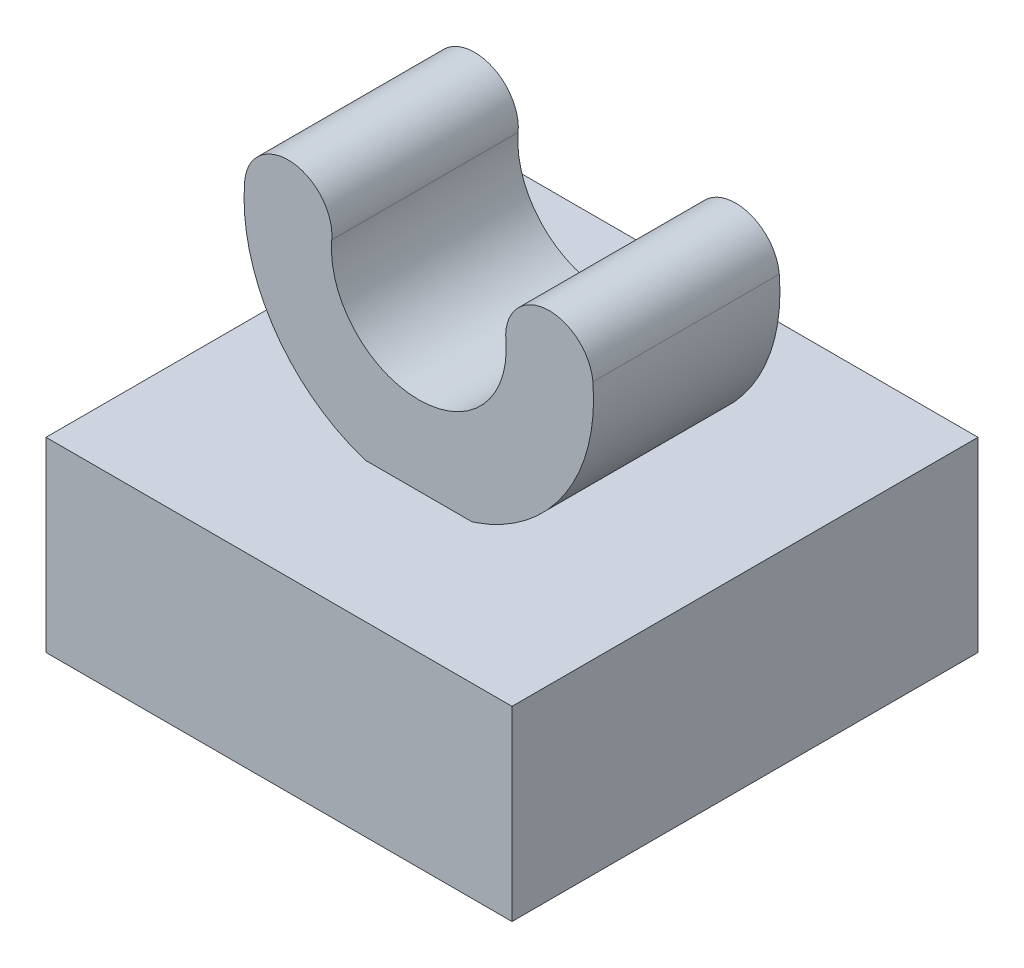
ISO-10303-21;
HEADER;
FILE_DESCRIPTION(('STEP AP214'),'2;1');
FILE_NAME('part.step','',(''),(''),'','','');
FILE_SCHEMA(('AUTOMOTIVE_DESIGN { 1 0 10303 214 1 1 1 1 }'));
ENDSEC;
DATA;
#1=APPLICATION_CONTEXT('core data for automotive mechanical design processes');
#2=APPLICATION_PROTOCOL_DEFINITION('international standard','automotive_design',2000,#1);
#3=PRODUCT_CONTEXT('',#1,'mechanical');
#4=PRODUCT('Part','Part','',(#3));
#5=PRODUCT_RELATED_PRODUCT_CATEGORY('part','',(#4));
#6=PRODUCT_DEFINITION_FORMATION('','',#4);
#7=PRODUCT_DEFINITION_CONTEXT('part definition',#1,'design');
#8=PRODUCT_DEFINITION('design','',#6,#7);
#9=PRODUCT_DEFINITION_SHAPE('','',#8);
#10=(LENGTH_UNIT() NAMED_UNIT(*) SI_UNIT(.MILLI.,.METRE.));
#11=(NAMED_UNIT(*) PLANE_ANGLE_UNIT() SI_UNIT($,.RADIAN.));
#12=(NAMED_UNIT(*) SI_UNIT($,.STERADIAN.) SOLID_ANGLE_UNIT());
#13=UNCERTAINTY_MEASURE_WITH_UNIT(LENGTH_MEASURE(1.E-05),#10,'distance_accuracy_value','');
#14=(GEOMETRIC_REPRESENTATION_CONTEXT(3) GLOBAL_UNCERTAINTY_ASSIGNED_CONTEXT((#13)) GLOBAL_UNIT_ASSIGNED_CONTEXT((#10,
#11,#12)) REPRESENTATION_CONTEXT('',''));
#15=CARTESIAN_POINT('',(0.,0.,0.));
#16=DIRECTION('',(0.,0.,1.));
#17=DIRECTION('',(1.,0.,0.));
#18=AXIS2_PLACEMENT_3D('',#15,#16,#17);
#19=CARTESIAN_POINT('',(-4.,-6.05675355524895,-2.4));
#20=DIRECTION('',(-1.,0.,0.));
#21=DIRECTION('',(0.,0.,1.));
#22=AXIS2_PLACEMENT_3D('',#19,#20,#21);
#23=PLANE('',#22);
#24=DIRECTION('',(0.,-1.,0.));
#25=VECTOR('',#24,1.);
#26=CARTESIAN_POINT('',(-4.,-6.05675355524895,5.6));
#27=LINE('',#26,#25);
#28=CARTESIAN_POINT('',(-4.,-2.85675355524895,5.6));
#29=VERTEX_POINT('',#28);
#30=CARTESIAN_POINT('',(-4.,-6.05675355524895,5.6));
#31=VERTEX_POINT('',#30);
#32=EDGE_CURVE('E170',#29,#31,#27,.T.);
#33=ORIENTED_EDGE('',*,*,#32,.F.);
#34=DIRECTION('',(0.,0.,1.));
#35=VECTOR('',#34,1.);
#36=CARTESIAN_POINT('',(-4.,-2.85675355524895,-2.4));
#37=LINE('',#36,#35);
#38=CARTESIAN_POINT('',(-4.,-2.85675355524895,-2.4));
#39=VERTEX_POINT('',#38);
#40=EDGE_CURVE('E12',#39,#29,#37,.T.);
#41=ORIENTED_EDGE('',*,*,#40,.F.);
#42=DIRECTION('',(0.,-1.,0.));
#43=VECTOR('',#42,1.);
#44=CARTESIAN_POINT('',(-4.,-6.05675355524895,-2.4));
#45=LINE('',#44,#43);
#46=CARTESIAN_POINT('',(-4.,-6.05675355524895,-2.4));
#47=VERTEX_POINT('',#46);
#48=EDGE_CURVE('E176',#39,#47,#45,.T.);
#49=ORIENTED_EDGE('',*,*,#48,.T.);
#50=DIRECTION('',(0.,0.,1.));
#51=VECTOR('',#50,1.);
#52=CARTESIAN_POINT('',(-4.,-6.05675355524895,-2.4));
#53=LINE('',#52,#51);
#54=EDGE_CURVE('E55',#47,#31,#53,.T.);
#55=ORIENTED_EDGE('',*,*,#54,.T.);
#56=EDGE_LOOP('',(#33,#41,#49,#55));
#57=FACE_BOUND('',#56,.T.);
#58=ADVANCED_FACE('F52',(#57),#23,.T.);
#59=CARTESIAN_POINT('',(-4.,-2.85675355524895,-2.4));
#60=DIRECTION('',(0.,1.,0.));
#61=DIRECTION('',(-1.,0.,0.));
#62=AXIS2_PLACEMENT_3D('',#59,#60,#61);
#63=PLANE('',#62);
#64=DIRECTION('',(-1.,0.,0.));
#65=VECTOR('',#64,1.);
#66=CARTESIAN_POINT('',(-4.,-2.85675355524895,5.6));
#67=LINE('',#66,#65);
#68=CARTESIAN_POINT('',(4.,-2.85675355524895,5.6));
#69=VERTEX_POINT('',#68);
#70=EDGE_CURVE('E180',#69,#29,#67,.T.);
#71=ORIENTED_EDGE('',*,*,#70,.F.);
#72=DIRECTION('',(0.,0.,1.));
#73=VECTOR('',#72,1.);
#74=CARTESIAN_POINT('',(4.,-2.85675355524895,-2.4));
#75=LINE('',#74,#73);
#76=CARTESIAN_POINT('',(4.,-2.85675355524895,-2.4));
#77=VERTEX_POINT('',#76);
#78=EDGE_CURVE('E61',#77,#69,#75,.T.);
#79=ORIENTED_EDGE('',*,*,#78,.F.);
#80=DIRECTION('',(-1.,0.,0.));
#81=VECTOR('',#80,1.);
#82=CARTESIAN_POINT('',(-4.,-2.85675355524895,-2.4));
#83=LINE('',#82,#81);
#84=EDGE_CURVE('E187',#77,#39,#83,.T.);
#85=ORIENTED_EDGE('',*,*,#84,.T.);
#86=ORIENTED_EDGE('',*,*,#40,.T.);
#87=EDGE_LOOP('',(#71,#79,#85,#86));
#88=FACE_BOUND('',#87,.T.);
#89=ADVANCED_FACE('F212',(#88),#63,.T.);
#90=CARTESIAN_POINT('',(4.,-6.05675355524895,-2.4));
#91=DIRECTION('',(1.,0.,0.));
#92=DIRECTION('',(0.,1.,0.));
#93=AXIS2_PLACEMENT_3D('',#90,#91,#92);
#94=PLANE('',#93);
#95=DIRECTION('',(0.,1.,0.));
#96=VECTOR('',#95,1.);
#97=CARTESIAN_POINT('',(4.,-6.05675355524895,5.6));
#98=LINE('',#97,#96);
#99=CARTESIAN_POINT('',(4.,-6.05675355524895,5.6));
#100=VERTEX_POINT('',#99);
#101=EDGE_CURVE('E197',#100,#69,#98,.T.);
#102=ORIENTED_EDGE('',*,*,#101,.F.);
#103=DIRECTION('',(0.,0.,1.));
#104=VECTOR('',#103,1.);
#105=CARTESIAN_POINT('',(4.,-6.05675355524895,-2.4));
#106=LINE('',#105,#104);
#107=CARTESIAN_POINT('',(4.,-6.05675355524895,-2.4));
#108=VERTEX_POINT('',#107);
#109=EDGE_CURVE('E205',#108,#100,#106,.T.);
#110=ORIENTED_EDGE('',*,*,#109,.F.);
#111=DIRECTION('',(0.,1.,0.));
#112=VECTOR('',#111,1.);
#113=CARTESIAN_POINT('',(4.,-6.05675355524895,-2.4));
#114=LINE('',#113,#112);
#115=EDGE_CURVE('E183',#108,#77,#114,.T.);
#116=ORIENTED_EDGE('',*,*,#115,.T.);
#117=ORIENTED_EDGE('',*,*,#78,.T.);
#118=EDGE_LOOP('',(#102,#110,#116,#117));
#119=FACE_BOUND('',#118,.T.);
#120=ADVANCED_FACE('F216',(#119),#94,.T.);
#121=CARTESIAN_POINT('',(-4.,-6.05675355524895,-2.4));
#122=DIRECTION('',(0.,-1.,0.));
#123=DIRECTION('',(1.,0.,0.));
#124=AXIS2_PLACEMENT_3D('',#121,#122,#123);
#125=PLANE('',#124);
#126=DIRECTION('',(0.,0.,-1.));
#127=VECTOR('',#126,1.);
#128=CARTESIAN_POINT('',(-2.4,-6.05675355524895,4.));
#129=LINE('',#128,#127);
#130=CARTESIAN_POINT('',(-2.4,-6.05675355524895,4.));
#131=VERTEX_POINT('',#130);
#132=CARTESIAN_POINT('',(-2.4,-6.05675355524895,-0.799999999999999));
#133=VERTEX_POINT('',#132);
#134=EDGE_CURVE('E69',#131,#133,#129,.T.);
#135=ORIENTED_EDGE('',*,*,#134,.F.);
#136=DIRECTION('',(-1.,0.,0.));
#137=VECTOR('',#136,1.);
#138=CARTESIAN_POINT('',(-2.4,-6.05675355524895,4.));
#139=LINE('',#138,#137);
#140=CARTESIAN_POINT('',(2.4,-6.05675355524895,4.));
#141=VERTEX_POINT('',#140);
#142=EDGE_CURVE('E148',#141,#131,#139,.T.);
#143=ORIENTED_EDGE('',*,*,#142,.F.);
#144=DIRECTION('',(0.,0.,1.));
#145=VECTOR('',#144,1.);
#146=CARTESIAN_POINT('',(2.4,-6.05675355524895,4.));
#147=LINE('',#146,#145);
#148=CARTESIAN_POINT('',(2.4,-6.05675355524895,-0.799999999999999));
#149=VERTEX_POINT('',#148);
#150=EDGE_CURVE('E152',#149,#141,#147,.T.);
#151=ORIENTED_EDGE('',*,*,#150,.F.);
#152=DIRECTION('',(1.,0.,0.));
#153=VECTOR('',#152,1.);
#154=CARTESIAN_POINT('',(-2.4,-6.05675355524895,-0.799999999999999));
#155=LINE('',#154,#153);
#156=EDGE_CURVE('E161',#133,#149,#155,.T.);
#157=ORIENTED_EDGE('',*,*,#156,.F.);
#158=EDGE_LOOP('',(#135,#143,#151,#157));
#159=FACE_BOUND('',#158,.T.);
#160=DIRECTION('',(1.,0.,0.));
#161=VECTOR('',#160,1.);
#162=CARTESIAN_POINT('',(-4.,-6.05675355524895,5.6));
#163=LINE('',#162,#161);
#164=EDGE_CURVE('E193',#31,#100,#163,.T.);
#165=ORIENTED_EDGE('',*,*,#164,.F.);
#166=ORIENTED_EDGE('',*,*,#54,.F.);
#167=DIRECTION('',(1.,0.,0.));
#168=VECTOR('',#167,1.);
#169=CARTESIAN_POINT('',(-4.,-6.05675355524895,-2.4));
#170=LINE('',#169,#168);
#171=EDGE_CURVE('E179',#47,#108,#170,.T.);
#172=ORIENTED_EDGE('',*,*,#171,.T.);
#173=ORIENTED_EDGE('',*,*,#109,.T.);
#174=EDGE_LOOP('',(#165,#166,#172,#173));
#175=FACE_BOUND('',#174,.T.);
#176=ADVANCED_FACE('F209',(#159,#175),#125,.T.);
#177=CARTESIAN_POINT('',(0.,0.,-2.4));
#178=DIRECTION('',(0.,0.,-1.));
#179=DIRECTION('',(-1.,0.,0.));
#180=AXIS2_PLACEMENT_3D('',#177,#178,#179);
#181=PLANE('',#180);
#182=ORIENTED_EDGE('',*,*,#48,.F.);
#183=ORIENTED_EDGE('',*,*,#84,.F.);
#184=ORIENTED_EDGE('',*,*,#115,.F.);
#185=ORIENTED_EDGE('',*,*,#171,.F.);
#186=EDGE_LOOP('',(#182,#183,#184,#185));
#187=FACE_BOUND('',#186,.T.);
#188=ADVANCED_FACE('F218',(#187),#181,.T.);
#189=CARTESIAN_POINT('',(0.,0.,5.6));
#190=DIRECTION('',(0.,0.,-1.));
#191=DIRECTION('',(-1.,0.,0.));
#192=AXIS2_PLACEMENT_3D('',#189,#190,#191);
#193=PLANE('',#192);
#194=ORIENTED_EDGE('',*,*,#32,.T.);
#195=ORIENTED_EDGE('',*,*,#164,.T.);
#196=ORIENTED_EDGE('',*,*,#101,.T.);
#197=ORIENTED_EDGE('',*,*,#70,.T.);
#198=EDGE_LOOP('',(#194,#195,#196,#197));
#199=FACE_BOUND('',#198,.T.);
#200=ADVANCED_FACE('F211',(#199),#193,.F.);
#201=CARTESIAN_POINT('',(-2.4,-4.25675355524895,4.));
#202=DIRECTION('',(-1.,0.,0.));
#203=DIRECTION('',(0.,-1.,0.));
#204=AXIS2_PLACEMENT_3D('',#201,#202,#203);
#205=PLANE('',#204);
#206=ORIENTED_EDGE('',*,*,#134,.T.);
#207=DIRECTION('',(0.,-1.,0.));
#208=VECTOR('',#207,1.);
#209=CARTESIAN_POINT('',(-2.4,-4.25675355524895,-0.799999999999999));
#210=LINE('',#209,#208);
#211=CARTESIAN_POINT('',(-2.4,-4.25675355524895,-0.799999999999999));
#212=VERTEX_POINT('',#211);
#213=EDGE_CURVE('E123',#212,#133,#210,.T.);
#214=ORIENTED_EDGE('',*,*,#213,.F.);
#215=DIRECTION('',(0.,0.,-1.));
#216=VECTOR('',#215,1.);
#217=CARTESIAN_POINT('',(-2.4,-4.25675355524895,4.));
#218=LINE('',#217,#216);
#219=CARTESIAN_POINT('',(-2.4,-4.25675355524895,4.));
#220=VERTEX_POINT('',#219);
#221=EDGE_CURVE('E127',#220,#212,#218,.T.);
#222=ORIENTED_EDGE('',*,*,#221,.F.);
#223=DIRECTION('',(0.,-1.,0.));
#224=VECTOR('',#223,1.);
#225=CARTESIAN_POINT('',(-2.4,-4.25675355524895,4.));
#226=LINE('',#225,#224);
#227=EDGE_CURVE('E167',#220,#131,#226,.T.);
#228=ORIENTED_EDGE('',*,*,#227,.T.);
#229=EDGE_LOOP('',(#206,#214,#222,#228));
#230=FACE_BOUND('',#229,.T.);
#231=ADVANCED_FACE('F125',(#230),#205,.F.);
#232=CARTESIAN_POINT('',(-2.4,-4.25675355524895,4.));
#233=DIRECTION('',(0.,0.,1.));
#234=DIRECTION('',(1.,0.,0.));
#235=AXIS2_PLACEMENT_3D('',#232,#233,#234);
#236=PLANE('',#235);
#237=ORIENTED_EDGE('',*,*,#142,.T.);
#238=ORIENTED_EDGE('',*,*,#227,.F.);
#239=DIRECTION('',(-1.,0.,0.));
#240=VECTOR('',#239,1.);
#241=CARTESIAN_POINT('',(-2.4,-4.25675355524895,4.));
#242=LINE('',#241,#240);
#243=CARTESIAN_POINT('',(2.4,-4.25675355524895,4.));
#244=VERTEX_POINT('',#243);
#245=EDGE_CURVE('E134',#244,#220,#242,.T.);
#246=ORIENTED_EDGE('',*,*,#245,.F.);
#247=DIRECTION('',(0.,-1.,0.));
#248=VECTOR('',#247,1.);
#249=CARTESIAN_POINT('',(2.4,-4.25675355524895,4.));
#250=LINE('',#249,#248);
#251=EDGE_CURVE('E171',#244,#141,#250,.T.);
#252=ORIENTED_EDGE('',*,*,#251,.T.);
#253=EDGE_LOOP('',(#237,#238,#246,#252));
#254=FACE_BOUND('',#253,.T.);
#255=ADVANCED_FACE('F257',(#254),#236,.F.);
#256=CARTESIAN_POINT('',(2.4,-4.25675355524895,4.));
#257=DIRECTION('',(1.,0.,0.));
#258=DIRECTION('',(0.,1.,0.));
#259=AXIS2_PLACEMENT_3D('',#256,#257,#258);
#260=PLANE('',#259);
#261=ORIENTED_EDGE('',*,*,#150,.T.);
#262=ORIENTED_EDGE('',*,*,#251,.F.);
#263=DIRECTION('',(0.,0.,1.));
#264=VECTOR('',#263,1.);
#265=CARTESIAN_POINT('',(2.4,-4.25675355524895,4.));
#266=LINE('',#265,#264);
#267=CARTESIAN_POINT('',(2.4,-4.25675355524895,-0.799999999999999));
#268=VERTEX_POINT('',#267);
#269=EDGE_CURVE('E143',#268,#244,#266,.T.);
#270=ORIENTED_EDGE('',*,*,#269,.F.);
#271=DIRECTION('',(0.,-1.,0.));
#272=VECTOR('',#271,1.);
#273=CARTESIAN_POINT('',(2.4,-4.25675355524895,-0.799999999999999));
#274=LINE('',#273,#272);
#275=EDGE_CURVE('E133',#268,#149,#274,.T.);
#276=ORIENTED_EDGE('',*,*,#275,.T.);
#277=EDGE_LOOP('',(#261,#262,#270,#276));
#278=FACE_BOUND('',#277,.T.);
#279=ADVANCED_FACE('F266',(#278),#260,.F.);
#280=CARTESIAN_POINT('',(-2.4,-4.25675355524895,-0.799999999999999));
#281=DIRECTION('',(0.,0.,-1.));
#282=DIRECTION('',(-1.,0.,0.));
#283=AXIS2_PLACEMENT_3D('',#280,#281,#282);
#284=PLANE('',#283);
#285=ORIENTED_EDGE('',*,*,#156,.T.);
#286=ORIENTED_EDGE('',*,*,#275,.F.);
#287=DIRECTION('',(1.,0.,0.));
#288=VECTOR('',#287,1.);
#289=CARTESIAN_POINT('',(-2.4,-4.25675355524895,-0.799999999999999));
#290=LINE('',#289,#288);
#291=EDGE_CURVE('E137',#212,#268,#290,.T.);
#292=ORIENTED_EDGE('',*,*,#291,.F.);
#293=ORIENTED_EDGE('',*,*,#213,.T.);
#294=EDGE_LOOP('',(#285,#286,#292,#293));
#295=FACE_BOUND('',#294,.T.);
#296=ADVANCED_FACE('F138',(#295),#284,.F.);
#297=CARTESIAN_POINT('',(0.,-4.25675355524895,0.));
#298=DIRECTION('',(0.,-1.,0.));
#299=DIRECTION('',(0.,0.,-1.));
#300=AXIS2_PLACEMENT_3D('',#297,#298,#299);
#301=PLANE('',#300);
#302=ORIENTED_EDGE('',*,*,#221,.T.);
#303=ORIENTED_EDGE('',*,*,#291,.T.);
#304=ORIENTED_EDGE('',*,*,#269,.T.);
#305=ORIENTED_EDGE('',*,*,#245,.T.);
#306=EDGE_LOOP('',(#302,#303,#304,#305));
#307=FACE_BOUND('',#306,.T.);
#308=ADVANCED_FACE('F145',(#307),#301,.T.);
#309=CLOSED_SHELL('',(#58,#89,#120,#176,#188,#200,#231,#255,#279,#296,#308));
#310=MANIFOLD_SOLID_BREP('B2',#309);
#311=CARTESIAN_POINT('',(-2.24143807070643,0.196100421182224,3.2));
#312=DIRECTION('',(0.,0.,-1.));
#313=DIRECTION('',(-1.,0.,0.));
#314=AXIS2_PLACEMENT_3D('',#311,#312,#313);
#315=CYLINDRICAL_SURFACE('',#314,0.750000000000001);
#316=CARTESIAN_POINT('',(-2.24143807070643,0.196100421182224,0.));
#317=DIRECTION('',(0.,0.,1.));
#318=DIRECTION('',(1.,0.,0.));
#319=AXIS2_PLACEMENT_3D('',#316,#317,#318);
#320=CIRCLE('',#319,0.750000000000001);
#321=CARTESIAN_POINT('',(-1.49429204713762,0.130733614121483,0.));
#322=VERTEX_POINT('',#321);
#323=CARTESIAN_POINT('',(-2.98858409427524,0.261467228242965,0.));
#324=VERTEX_POINT('',#323);
#325=EDGE_CURVE('E399',#322,#324,#320,.T.);
#326=ORIENTED_EDGE('',*,*,#325,.T.);
#327=DIRECTION('',(0.,0.,-1.));
#328=VECTOR('',#327,1.);
#329=CARTESIAN_POINT('',(-2.98858409427524,0.261467228242965,3.2));
#330=LINE('',#329,#328);
#331=CARTESIAN_POINT('',(-2.98858409427524,0.261467228242965,3.2));
#332=VERTEX_POINT('',#331);
#333=EDGE_CURVE('E50',#332,#324,#330,.T.);
#334=ORIENTED_EDGE('',*,*,#333,.F.);
#335=CARTESIAN_POINT('',(-2.24143807070643,0.196100421182224,3.2));
#336=DIRECTION('',(0.,0.,1.));
#337=DIRECTION('',(1.,0.,0.));
#338=AXIS2_PLACEMENT_3D('',#335,#336,#337);
#339=CIRCLE('',#338,0.750000000000001);
#340=CARTESIAN_POINT('',(-1.49429204713762,0.130733614121483,3.2));
#341=VERTEX_POINT('',#340);
#342=EDGE_CURVE('E387',#341,#332,#339,.T.);
#343=ORIENTED_EDGE('',*,*,#342,.F.);
#344=DIRECTION('',(0.,0.,-1.));
#345=VECTOR('',#344,1.);
#346=CARTESIAN_POINT('',(-1.49429204713762,0.130733614121483,3.2));
#347=LINE('',#346,#345);
#348=EDGE_CURVE('E395',#341,#322,#347,.T.);
#349=ORIENTED_EDGE('',*,*,#348,.T.);
#350=EDGE_LOOP('',(#326,#334,#343,#349));
#351=FACE_BOUND('',#350,.T.);
#352=ADVANCED_FACE('F336',(#351),#315,.T.);
#353=CARTESIAN_POINT('',(0.,0.,3.2));
#354=DIRECTION('',(0.,0.,-1.));
#355=DIRECTION('',(-1.,0.,0.));
#356=AXIS2_PLACEMENT_3D('',#353,#354,#355);
#357=CYLINDRICAL_SURFACE('',#356,3.);
#358=CARTESIAN_POINT('',(0.,0.,0.));
#359=DIRECTION('',(0.,0.,1.));
#360=DIRECTION('',(1.,0.,0.));
#361=AXIS2_PLACEMENT_3D('',#358,#359,#360);
#362=CIRCLE('',#361,3.);
#363=CARTESIAN_POINT('',(2.98858409427524,0.261467228242985,0.));
#364=VERTEX_POINT('',#363);
#365=EDGE_CURVE('E391',#324,#364,#362,.T.);
#366=ORIENTED_EDGE('',*,*,#365,.T.);
#367=DIRECTION('',(0.,0.,-1.));
#368=VECTOR('',#367,1.);
#369=CARTESIAN_POINT('',(2.98858409427524,0.261467228242985,3.2));
#370=LINE('',#369,#368);
#371=CARTESIAN_POINT('',(2.98858409427524,0.261467228242985,3.2));
#372=VERTEX_POINT('',#371);
#373=EDGE_CURVE('E344',#372,#364,#370,.T.);
#374=ORIENTED_EDGE('',*,*,#373,.F.);
#375=CARTESIAN_POINT('',(0.,0.,3.2));
#376=DIRECTION('',(0.,0.,1.));
#377=DIRECTION('',(1.,0.,0.));
#378=AXIS2_PLACEMENT_3D('',#375,#376,#377);
#379=CIRCLE('',#378,3.);
#380=EDGE_CURVE('E382',#332,#372,#379,.T.);
#381=ORIENTED_EDGE('',*,*,#380,.F.);
#382=ORIENTED_EDGE('',*,*,#333,.T.);
#383=EDGE_LOOP('',(#366,#374,#381,#382));
#384=FACE_BOUND('',#383,.T.);
#385=ADVANCED_FACE('F390',(#384),#357,.T.);
#386=CARTESIAN_POINT('',(2.24143807070643,0.196100421182239,3.2));
#387=DIRECTION('',(0.,0.,-1.));
#388=DIRECTION('',(-1.,0.,0.));
#389=AXIS2_PLACEMENT_3D('',#386,#387,#388);
#390=CYLINDRICAL_SURFACE('',#389,0.75);
#391=CARTESIAN_POINT('',(2.24143807070643,0.196100421182239,0.));
#392=DIRECTION('',(0.,0.,1.));
#393=DIRECTION('',(1.,0.,0.));
#394=AXIS2_PLACEMENT_3D('',#391,#392,#393);
#395=CIRCLE('',#394,0.75);
#396=CARTESIAN_POINT('',(1.49429204713762,0.130733614121493,0.));
#397=VERTEX_POINT('',#396);
#398=EDGE_CURVE('E369',#364,#397,#395,.T.);
#399=ORIENTED_EDGE('',*,*,#398,.T.);
#400=DIRECTION('',(0.,0.,-1.));
#401=VECTOR('',#400,1.);
#402=CARTESIAN_POINT('',(1.49429204713762,0.130733614121493,3.2));
#403=LINE('',#402,#401);
#404=CARTESIAN_POINT('',(1.49429204713762,0.130733614121493,3.2));
#405=VERTEX_POINT('',#404);
#406=EDGE_CURVE('E392',#405,#397,#403,.T.);
#407=ORIENTED_EDGE('',*,*,#406,.F.);
#408=CARTESIAN_POINT('',(2.24143807070643,0.196100421182239,3.2));
#409=DIRECTION('',(0.,0.,1.));
#410=DIRECTION('',(1.,0.,0.));
#411=AXIS2_PLACEMENT_3D('',#408,#409,#410);
#412=CIRCLE('',#411,0.75);
#413=EDGE_CURVE('E385',#372,#405,#412,.T.);
#414=ORIENTED_EDGE('',*,*,#413,.F.);
#415=ORIENTED_EDGE('',*,*,#373,.T.);
#416=EDGE_LOOP('',(#399,#407,#414,#415));
#417=FACE_BOUND('',#416,.T.);
#418=ADVANCED_FACE('F393',(#417),#390,.T.);
#419=CARTESIAN_POINT('',(0.,0.,3.2));
#420=DIRECTION('',(0.,0.,-1.));
#421=DIRECTION('',(-1.,0.,0.));
#422=AXIS2_PLACEMENT_3D('',#419,#420,#421);
#423=CYLINDRICAL_SURFACE('',#422,1.5);
#424=CARTESIAN_POINT('',(0.,0.,0.));
#425=DIRECTION('',(0.,0.,-1.));
#426=DIRECTION('',(1.,0.,0.));
#427=AXIS2_PLACEMENT_3D('',#424,#425,#426);
#428=CIRCLE('',#427,1.5);
#429=EDGE_CURVE('E375',#397,#322,#428,.T.);
#430=ORIENTED_EDGE('',*,*,#429,.T.);
#431=ORIENTED_EDGE('',*,*,#348,.F.);
#432=CARTESIAN_POINT('',(0.,0.,3.2));
#433=DIRECTION('',(0.,0.,-1.));
#434=DIRECTION('',(1.,0.,0.));
#435=AXIS2_PLACEMENT_3D('',#432,#433,#434);
#436=CIRCLE('',#435,1.5);
#437=EDGE_CURVE('E352',#405,#341,#436,.T.);
#438=ORIENTED_EDGE('',*,*,#437,.F.);
#439=ORIENTED_EDGE('',*,*,#406,.T.);
#440=EDGE_LOOP('',(#430,#431,#438,#439));
#441=FACE_BOUND('',#440,.T.);
#442=ADVANCED_FACE('F406',(#441),#423,.F.);
#443=CARTESIAN_POINT('',(-1.12071903535321,0.098050210591112,3.2));
#444=DIRECTION('',(0.,0.,1.));
#445=DIRECTION('',(1.,0.,0.));
#446=AXIS2_PLACEMENT_3D('',#443,#444,#445);
#447=PLANE('',#446);
#448=ORIENTED_EDGE('',*,*,#342,.T.);
#449=ORIENTED_EDGE('',*,*,#380,.T.);
#450=ORIENTED_EDGE('',*,*,#413,.T.);
#451=ORIENTED_EDGE('',*,*,#437,.T.);
#452=EDGE_LOOP('',(#448,#449,#450,#451));
#453=FACE_BOUND('',#452,.T.);
#454=ADVANCED_FACE('F383',(#453),#447,.T.);
#455=CARTESIAN_POINT('',(-1.12071903535321,0.098050210591112,0.));
#456=DIRECTION('',(0.,0.,1.));
#457=DIRECTION('',(1.,0.,0.));
#458=AXIS2_PLACEMENT_3D('',#455,#456,#457);
#459=PLANE('',#458);
#460=ORIENTED_EDGE('',*,*,#325,.F.);
#461=ORIENTED_EDGE('',*,*,#429,.F.);
#462=ORIENTED_EDGE('',*,*,#398,.F.);
#463=ORIENTED_EDGE('',*,*,#365,.F.);
#464=EDGE_LOOP('',(#460,#461,#462,#463));
#465=FACE_BOUND('',#464,.T.);
#466=ADVANCED_FACE('F409',(#465),#459,.F.);
#467=CLOSED_SHELL('',(#352,#385,#418,#442,#454,#466));
#468=MANIFOLD_SOLID_BREP('B6',#467);
#469=ADVANCED_BREP_SHAPE_REPRESENTATION('',(#18,#310,#468),#14);
#470=SHAPE_DEFINITION_REPRESENTATION(#9,#469);
ENDSEC;
END-ISO-10303-21;
